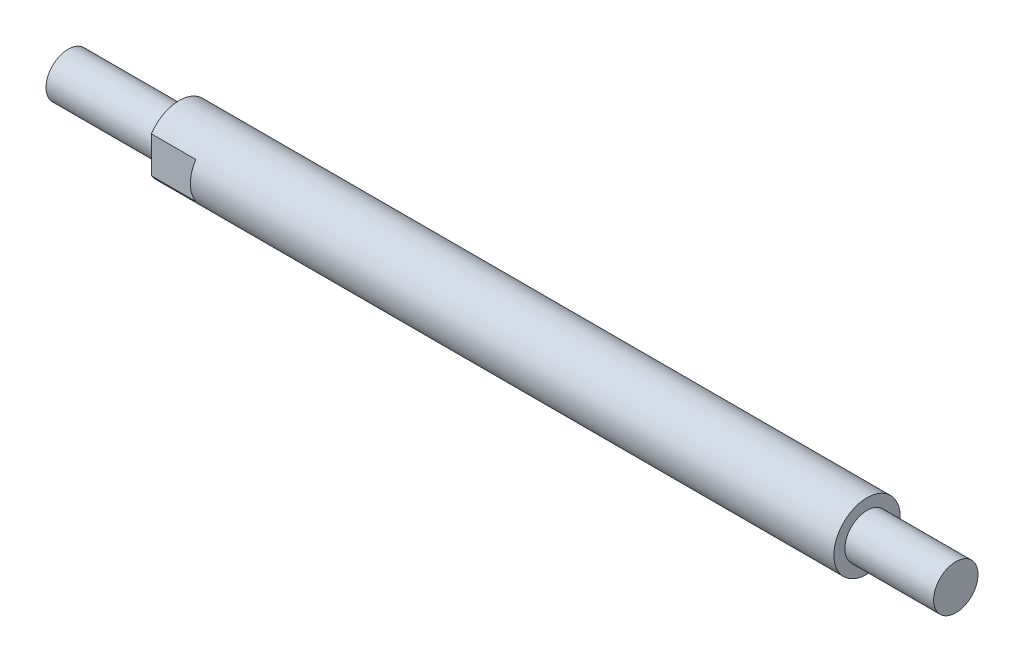
ISO-10303-21;
HEADER;
FILE_DESCRIPTION(('STEP AP214'),'2;1');
FILE_NAME('part.step','',(''),(''),'','','');
FILE_SCHEMA(('AUTOMOTIVE_DESIGN { 1 0 10303 214 1 1 1 1 }'));
ENDSEC;
DATA;
#1=APPLICATION_CONTEXT('core data for automotive mechanical design processes');
#2=APPLICATION_PROTOCOL_DEFINITION('international standard','automotive_design',2000,#1);
#3=PRODUCT_CONTEXT('',#1,'mechanical');
#4=PRODUCT('Part','Part','',(#3));
#5=PRODUCT_RELATED_PRODUCT_CATEGORY('part','',(#4));
#6=PRODUCT_DEFINITION_FORMATION('','',#4);
#7=PRODUCT_DEFINITION_CONTEXT('part definition',#1,'design');
#8=PRODUCT_DEFINITION('design','',#6,#7);
#9=PRODUCT_DEFINITION_SHAPE('','',#8);
#10=(LENGTH_UNIT() NAMED_UNIT(*) SI_UNIT(.MILLI.,.METRE.));
#11=(NAMED_UNIT(*) PLANE_ANGLE_UNIT() SI_UNIT($,.RADIAN.));
#12=(NAMED_UNIT(*) SI_UNIT($,.STERADIAN.) SOLID_ANGLE_UNIT());
#13=UNCERTAINTY_MEASURE_WITH_UNIT(LENGTH_MEASURE(1.E-05),#10,'distance_accuracy_value','');
#14=(GEOMETRIC_REPRESENTATION_CONTEXT(3) GLOBAL_UNCERTAINTY_ASSIGNED_CONTEXT((#13)) GLOBAL_UNIT_ASSIGNED_CONTEXT((#10,
#11,#12)) REPRESENTATION_CONTEXT('',''));
#15=CARTESIAN_POINT('',(0.,0.,0.));
#16=DIRECTION('',(0.,0.,1.));
#17=DIRECTION('',(1.,0.,0.));
#18=AXIS2_PLACEMENT_3D('',#15,#16,#17);
#19=CARTESIAN_POINT('',(114.3,0.,0.));
#20=DIRECTION('',(-1.,0.,0.));
#21=DIRECTION('',(0.,0.,1.));
#22=AXIS2_PLACEMENT_3D('',#19,#20,#21);
#23=CYLINDRICAL_SURFACE('',#22,4.745);
#24=CARTESIAN_POINT('',(114.3,0.,0.));
#25=DIRECTION('',(1.,0.,0.));
#26=DIRECTION('',(0.,0.,-1.));
#27=AXIS2_PLACEMENT_3D('',#24,#25,#26);
#28=CIRCLE('',#27,4.745);
#29=CARTESIAN_POINT('',(114.3,0.,-4.745));
#30=VERTEX_POINT('',#29);
#31=EDGE_CURVE('E11',#30,#30,#28,.T.);
#32=ORIENTED_EDGE('',*,*,#31,.F.);
#33=EDGE_LOOP('',(#32));
#34=FACE_BOUND('',#33,.T.);
#35=CARTESIAN_POINT('',(22.225,0.,0.));
#36=DIRECTION('',(-1.,0.,0.));
#37=DIRECTION('',(0.,0.,1.));
#38=AXIS2_PLACEMENT_3D('',#35,#36,#37);
#39=CIRCLE('',#38,4.745);
#40=CARTESIAN_POINT('',(22.225,-2.60077842914386,3.96875));
#41=VERTEX_POINT('',#40);
#42=CARTESIAN_POINT('',(22.225,2.60077842914386,3.96875));
#43=VERTEX_POINT('',#42);
#44=EDGE_CURVE('E80',#41,#43,#39,.T.);
#45=ORIENTED_EDGE('',*,*,#44,.F.);
#46=DIRECTION('',(-1.,0.,0.));
#47=VECTOR('',#46,1.);
#48=CARTESIAN_POINT('',(22.225,-2.60077842914386,3.96875));
#49=LINE('',#48,#47);
#50=CARTESIAN_POINT('',(15.875,-2.60077842914386,3.96875));
#51=VERTEX_POINT('',#50);
#52=EDGE_CURVE('E88',#41,#51,#49,.T.);
#53=ORIENTED_EDGE('',*,*,#52,.T.);
#54=CARTESIAN_POINT('',(15.875,0.,0.));
#55=DIRECTION('',(-1.,0.,0.));
#56=DIRECTION('',(0.,0.,1.));
#57=AXIS2_PLACEMENT_3D('',#54,#55,#56);
#58=CIRCLE('',#57,4.745);
#59=CARTESIAN_POINT('',(15.875,-2.60077842914387,-3.96875));
#60=VERTEX_POINT('',#59);
#61=EDGE_CURVE('E113',#60,#51,#58,.T.);
#62=ORIENTED_EDGE('',*,*,#61,.F.);
#63=DIRECTION('',(-1.,0.,0.));
#64=VECTOR('',#63,1.);
#65=CARTESIAN_POINT('',(22.225,-2.60077842914386,-3.96875));
#66=LINE('',#65,#64);
#67=CARTESIAN_POINT('',(22.225,-2.60077842914386,-3.96875));
#68=VERTEX_POINT('',#67);
#69=EDGE_CURVE('E59',#68,#60,#66,.T.);
#70=ORIENTED_EDGE('',*,*,#69,.F.);
#71=CARTESIAN_POINT('',(22.225,0.,0.));
#72=DIRECTION('',(-1.,0.,0.));
#73=DIRECTION('',(0.,0.,1.));
#74=AXIS2_PLACEMENT_3D('',#71,#72,#73);
#75=CIRCLE('',#74,4.745);
#76=CARTESIAN_POINT('',(22.225,2.60077842914386,-3.96875));
#77=VERTEX_POINT('',#76);
#78=EDGE_CURVE('E98',#77,#68,#75,.T.);
#79=ORIENTED_EDGE('',*,*,#78,.F.);
#80=DIRECTION('',(-1.,0.,0.));
#81=VECTOR('',#80,1.);
#82=CARTESIAN_POINT('',(22.225,2.60077842914386,-3.96875));
#83=LINE('',#82,#81);
#84=CARTESIAN_POINT('',(15.875,2.60077842914385,-3.96875));
#85=VERTEX_POINT('',#84);
#86=EDGE_CURVE('E104',#77,#85,#83,.T.);
#87=ORIENTED_EDGE('',*,*,#86,.T.);
#88=CARTESIAN_POINT('',(15.875,2.60077842914385,3.96875));
#89=VERTEX_POINT('',#88);
#90=EDGE_CURVE('E92',#89,#85,#58,.T.);
#91=ORIENTED_EDGE('',*,*,#90,.F.);
#92=DIRECTION('',(-1.,0.,0.));
#93=VECTOR('',#92,1.);
#94=CARTESIAN_POINT('',(22.225,2.60077842914386,3.96875));
#95=LINE('',#94,#93);
#96=EDGE_CURVE('E51',#43,#89,#95,.T.);
#97=ORIENTED_EDGE('',*,*,#96,.F.);
#98=EDGE_LOOP('',(#45,#53,#62,#70,#79,#87,#91,#97));
#99=FACE_BOUND('',#98,.T.);
#100=ADVANCED_FACE('F36',(#34,#99),#23,.T.);
#101=CARTESIAN_POINT('',(114.3,0.,0.));
#102=DIRECTION('',(1.,0.,0.));
#103=DIRECTION('',(0.,0.,-1.));
#104=AXIS2_PLACEMENT_3D('',#101,#102,#103);
#105=PLANE('',#104);
#106=ORIENTED_EDGE('',*,*,#31,.T.);
#107=EDGE_LOOP('',(#106));
#108=FACE_BOUND('',#107,.T.);
#109=CARTESIAN_POINT('',(114.3,0.,0.));
#110=DIRECTION('',(1.,0.,0.));
#111=DIRECTION('',(0.,0.,-1.));
#112=AXIS2_PLACEMENT_3D('',#109,#110,#111);
#113=CIRCLE('',#112,3.175);
#114=CARTESIAN_POINT('',(114.3,0.,-3.175));
#115=VERTEX_POINT('',#114);
#116=EDGE_CURVE('E116',#115,#115,#113,.T.);
#117=ORIENTED_EDGE('',*,*,#116,.F.);
#118=EDGE_LOOP('',(#117));
#119=FACE_BOUND('',#118,.T.);
#120=ADVANCED_FACE('F123',(#108,#119),#105,.T.);
#121=CARTESIAN_POINT('',(127.,0.,0.));
#122=DIRECTION('',(-1.,0.,0.));
#123=DIRECTION('',(0.,0.,1.));
#124=AXIS2_PLACEMENT_3D('',#121,#122,#123);
#125=CYLINDRICAL_SURFACE('',#124,3.175);
#126=CARTESIAN_POINT('',(127.,0.,0.));
#127=DIRECTION('',(1.,0.,0.));
#128=DIRECTION('',(0.,0.,-1.));
#129=AXIS2_PLACEMENT_3D('',#126,#127,#128);
#130=CIRCLE('',#129,3.175);
#131=CARTESIAN_POINT('',(127.,0.,-3.175));
#132=VERTEX_POINT('',#131);
#133=EDGE_CURVE('E44',#132,#132,#130,.T.);
#134=ORIENTED_EDGE('',*,*,#133,.F.);
#135=EDGE_LOOP('',(#134));
#136=FACE_BOUND('',#135,.T.);
#137=ORIENTED_EDGE('',*,*,#116,.T.);
#138=EDGE_LOOP('',(#137));
#139=FACE_BOUND('',#138,.T.);
#140=ADVANCED_FACE('F121',(#136,#139),#125,.T.);
#141=CARTESIAN_POINT('',(127.,0.,0.));
#142=DIRECTION('',(1.,0.,0.));
#143=DIRECTION('',(0.,0.,-1.));
#144=AXIS2_PLACEMENT_3D('',#141,#142,#143);
#145=PLANE('',#144);
#146=ORIENTED_EDGE('',*,*,#133,.T.);
#147=EDGE_LOOP('',(#146));
#148=FACE_BOUND('',#147,.T.);
#149=ADVANCED_FACE('F131',(#148),#145,.T.);
#150=CARTESIAN_POINT('',(15.875,0.,0.));
#151=DIRECTION('',(-1.,0.,0.));
#152=DIRECTION('',(0.,0.,1.));
#153=AXIS2_PLACEMENT_3D('',#150,#151,#152);
#154=PLANE('',#153);
#155=DIRECTION('',(0.,-1.,0.));
#156=VECTOR('',#155,1.);
#157=CARTESIAN_POINT('',(15.875,2.60077842914385,3.96875));
#158=LINE('',#157,#156);
#159=EDGE_CURVE('E85',#89,#51,#158,.T.);
#160=ORIENTED_EDGE('',*,*,#159,.F.);
#161=ORIENTED_EDGE('',*,*,#90,.T.);
#162=DIRECTION('',(0.,1.,0.));
#163=VECTOR('',#162,1.);
#164=CARTESIAN_POINT('',(15.875,-2.60077842914387,-3.96875));
#165=LINE('',#164,#163);
#166=EDGE_CURVE('E94',#60,#85,#165,.T.);
#167=ORIENTED_EDGE('',*,*,#166,.F.);
#168=ORIENTED_EDGE('',*,*,#61,.T.);
#169=EDGE_LOOP('',(#160,#161,#167,#168));
#170=FACE_BOUND('',#169,.T.);
#171=CARTESIAN_POINT('',(15.875,0.,0.));
#172=DIRECTION('',(-1.,0.,0.));
#173=DIRECTION('',(0.,0.,1.));
#174=AXIS2_PLACEMENT_3D('',#171,#172,#173);
#175=CIRCLE('',#174,3.175);
#176=CARTESIAN_POINT('',(15.875,0.,3.175));
#177=VERTEX_POINT('',#176);
#178=EDGE_CURVE('E108',#177,#177,#175,.T.);
#179=ORIENTED_EDGE('',*,*,#178,.F.);
#180=EDGE_LOOP('',(#179));
#181=FACE_BOUND('',#180,.T.);
#182=ADVANCED_FACE('F147',(#170,#181),#154,.T.);
#183=CARTESIAN_POINT('',(15.875,0.,0.));
#184=DIRECTION('',(-1.,0.,0.));
#185=DIRECTION('',(0.,0.,1.));
#186=AXIS2_PLACEMENT_3D('',#183,#184,#185);
#187=CYLINDRICAL_SURFACE('',#186,3.175);
#188=ORIENTED_EDGE('',*,*,#178,.T.);
#189=EDGE_LOOP('',(#188));
#190=FACE_BOUND('',#189,.T.);
#191=CARTESIAN_POINT('',(0.,0.,0.));
#192=DIRECTION('',(-1.,0.,0.));
#193=DIRECTION('',(0.,0.,1.));
#194=AXIS2_PLACEMENT_3D('',#191,#192,#193);
#195=CIRCLE('',#194,3.175);
#196=CARTESIAN_POINT('',(0.,0.,3.175));
#197=VERTEX_POINT('',#196);
#198=EDGE_CURVE('E106',#197,#197,#195,.T.);
#199=ORIENTED_EDGE('',*,*,#198,.F.);
#200=EDGE_LOOP('',(#199));
#201=FACE_BOUND('',#200,.T.);
#202=ADVANCED_FACE('F139',(#190,#201),#187,.T.);
#203=CARTESIAN_POINT('',(0.,0.,0.));
#204=DIRECTION('',(1.,0.,0.));
#205=DIRECTION('',(0.,0.,-1.));
#206=AXIS2_PLACEMENT_3D('',#203,#204,#205);
#207=PLANE('',#206);
#208=ORIENTED_EDGE('',*,*,#198,.T.);
#209=EDGE_LOOP('',(#208));
#210=FACE_BOUND('',#209,.T.);
#211=ADVANCED_FACE('F136',(#210),#207,.F.);
#212=CARTESIAN_POINT('',(22.225,-2.60077842914386,-3.96875));
#213=DIRECTION('',(0.,0.,1.));
#214=DIRECTION('',(0.,-1.,0.));
#215=AXIS2_PLACEMENT_3D('',#212,#213,#214);
#216=PLANE('',#215);
#217=ORIENTED_EDGE('',*,*,#166,.T.);
#218=ORIENTED_EDGE('',*,*,#86,.F.);
#219=DIRECTION('',(0.,1.,0.));
#220=VECTOR('',#219,1.);
#221=CARTESIAN_POINT('',(22.225,-2.60077842914386,-3.96875));
#222=LINE('',#221,#220);
#223=EDGE_CURVE('E100',#68,#77,#222,.T.);
#224=ORIENTED_EDGE('',*,*,#223,.F.);
#225=ORIENTED_EDGE('',*,*,#69,.T.);
#226=EDGE_LOOP('',(#217,#218,#224,#225));
#227=FACE_BOUND('',#226,.T.);
#228=ADVANCED_FACE('F138',(#227),#216,.F.);
#229=CARTESIAN_POINT('',(22.225,0.,0.));
#230=DIRECTION('',(-1.,0.,0.));
#231=DIRECTION('',(0.,0.,1.));
#232=AXIS2_PLACEMENT_3D('',#229,#230,#231);
#233=PLANE('',#232);
#234=ORIENTED_EDGE('',*,*,#78,.T.);
#235=ORIENTED_EDGE('',*,*,#223,.T.);
#236=EDGE_LOOP('',(#234,#235));
#237=FACE_BOUND('',#236,.T.);
#238=ADVANCED_FACE('F145',(#237),#233,.T.);
#239=CARTESIAN_POINT('',(22.225,2.60077842914386,3.96875));
#240=DIRECTION('',(0.,0.,-1.));
#241=DIRECTION('',(-1.,0.,0.));
#242=AXIS2_PLACEMENT_3D('',#239,#240,#241);
#243=PLANE('',#242);
#244=ORIENTED_EDGE('',*,*,#159,.T.);
#245=ORIENTED_EDGE('',*,*,#52,.F.);
#246=DIRECTION('',(0.,-1.,0.));
#247=VECTOR('',#246,1.);
#248=CARTESIAN_POINT('',(22.225,2.60077842914386,3.96875));
#249=LINE('',#248,#247);
#250=EDGE_CURVE('E82',#43,#41,#249,.T.);
#251=ORIENTED_EDGE('',*,*,#250,.F.);
#252=ORIENTED_EDGE('',*,*,#96,.T.);
#253=EDGE_LOOP('',(#244,#245,#251,#252));
#254=FACE_BOUND('',#253,.T.);
#255=ADVANCED_FACE('F87',(#254),#243,.F.);
#256=CARTESIAN_POINT('',(22.225,0.,0.));
#257=DIRECTION('',(-1.,0.,0.));
#258=DIRECTION('',(0.,0.,1.));
#259=AXIS2_PLACEMENT_3D('',#256,#257,#258);
#260=PLANE('',#259);
#261=ORIENTED_EDGE('',*,*,#44,.T.);
#262=ORIENTED_EDGE('',*,*,#250,.T.);
#263=EDGE_LOOP('',(#261,#262));
#264=FACE_BOUND('',#263,.T.);
#265=ADVANCED_FACE('F81',(#264),#260,.T.);
#266=CLOSED_SHELL('',(#100,#120,#140,#149,#182,#202,#211,#228,#238,#255,#265));
#267=MANIFOLD_SOLID_BREP('B2',#266);
#268=ADVANCED_BREP_SHAPE_REPRESENTATION('',(#18,#267),#14);
#269=SHAPE_DEFINITION_REPRESENTATION(#9,#268);
ENDSEC;
END-ISO-10303-21;
